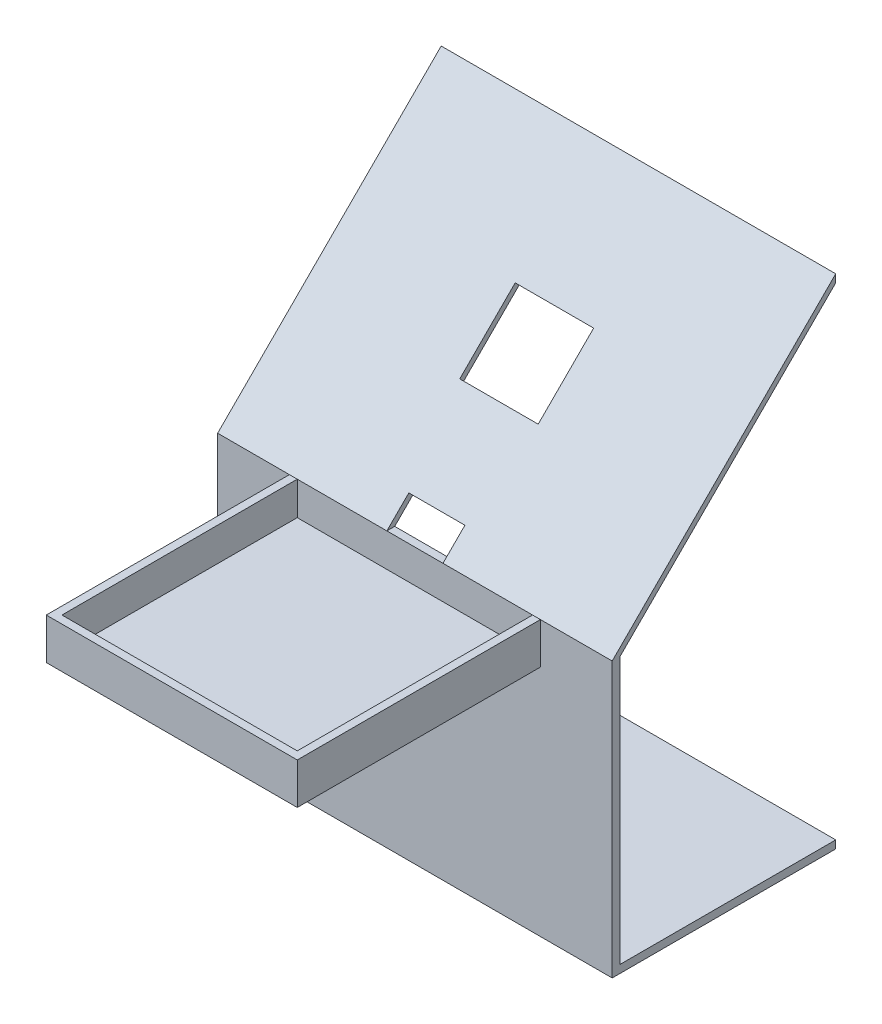
ISO-10303-21;
HEADER;
FILE_DESCRIPTION(('STEP AP214'),'2;1');
FILE_NAME('part.step','',(''),(''),'','','');
FILE_SCHEMA(('AUTOMOTIVE_DESIGN { 1 0 10303 214 1 1 1 1 }'));
ENDSEC;
DATA;
#1=APPLICATION_CONTEXT('core data for automotive mechanical design processes');
#2=APPLICATION_PROTOCOL_DEFINITION('international standard','automotive_design',2000,#1);
#3=PRODUCT_CONTEXT('',#1,'mechanical');
#4=PRODUCT('Part','Part','',(#3));
#5=PRODUCT_RELATED_PRODUCT_CATEGORY('part','',(#4));
#6=PRODUCT_DEFINITION_FORMATION('','',#4);
#7=PRODUCT_DEFINITION_CONTEXT('part definition',#1,'design');
#8=PRODUCT_DEFINITION('design','',#6,#7);
#9=PRODUCT_DEFINITION_SHAPE('','',#8);
#10=(LENGTH_UNIT() NAMED_UNIT(*) SI_UNIT(.MILLI.,.METRE.));
#11=(NAMED_UNIT(*) PLANE_ANGLE_UNIT() SI_UNIT($,.RADIAN.));
#12=(NAMED_UNIT(*) SI_UNIT($,.STERADIAN.) SOLID_ANGLE_UNIT());
#13=UNCERTAINTY_MEASURE_WITH_UNIT(LENGTH_MEASURE(1.E-05),#10,'distance_accuracy_value','');
#14=(GEOMETRIC_REPRESENTATION_CONTEXT(3) GLOBAL_UNCERTAINTY_ASSIGNED_CONTEXT((#13)) GLOBAL_UNIT_ASSIGNED_CONTEXT((#10,
#11,#12)) REPRESENTATION_CONTEXT('',''));
#15=CARTESIAN_POINT('',(0.,0.,0.));
#16=DIRECTION('',(0.,0.,1.));
#17=DIRECTION('',(1.,0.,0.));
#18=AXIS2_PLACEMENT_3D('',#15,#16,#17);
#19=CARTESIAN_POINT('',(50.3,70.,29.5));
#20=DIRECTION('',(0.,0.,1.));
#21=DIRECTION('',(1.,0.,0.));
#22=AXIS2_PLACEMENT_3D('',#19,#20,#21);
#23=PLANE('',#22);
#24=DIRECTION('',(-1.,0.,0.));
#25=VECTOR('',#24,1.);
#26=CARTESIAN_POINT('',(50.3,70.,29.5));
#27=LINE('',#26,#25);
#28=CARTESIAN_POINT('',(30.,70.,29.5));
#29=VERTEX_POINT('',#28);
#30=CARTESIAN_POINT('',(7.15,70.,29.5));
#31=VERTEX_POINT('',#30);
#32=EDGE_CURVE('E236',#29,#31,#27,.T.);
#33=ORIENTED_EDGE('',*,*,#32,.T.);
#34=CARTESIAN_POINT('',(-7.15,70.,29.5));
#35=VERTEX_POINT('',#34);
#36=EDGE_CURVE('E215',#31,#35,#27,.T.);
#37=ORIENTED_EDGE('',*,*,#36,.T.);
#38=CARTESIAN_POINT('',(-30.,70.,29.5));
#39=VERTEX_POINT('',#38);
#40=EDGE_CURVE('E221',#35,#39,#27,.T.);
#41=ORIENTED_EDGE('',*,*,#40,.T.);
#42=DIRECTION('',(0.,-1.,0.));
#43=VECTOR('',#42,1.);
#44=CARTESIAN_POINT('',(-30.,59.5,29.5));
#45=LINE('',#44,#43);
#46=CARTESIAN_POINT('',(-30.,61.5,29.5));
#47=VERTEX_POINT('',#46);
#48=EDGE_CURVE('E439',#39,#47,#45,.T.);
#49=ORIENTED_EDGE('',*,*,#48,.T.);
#50=DIRECTION('',(-1.,0.,0.));
#51=VECTOR('',#50,1.);
#52=CARTESIAN_POINT('',(-30.,61.5,29.5));
#53=LINE('',#52,#51);
#54=CARTESIAN_POINT('',(30.,61.5,29.5));
#55=VERTEX_POINT('',#54);
#56=EDGE_CURVE('E420',#55,#47,#53,.T.);
#57=ORIENTED_EDGE('',*,*,#56,.F.);
#58=DIRECTION('',(0.,1.,0.));
#59=VECTOR('',#58,1.);
#60=CARTESIAN_POINT('',(30.,70.,29.5));
#61=LINE('',#60,#59);
#62=EDGE_CURVE('E423',#55,#29,#61,.T.);
#63=ORIENTED_EDGE('',*,*,#62,.T.);
#64=EDGE_LOOP('',(#33,#37,#41,#49,#57,#63));
#65=FACE_BOUND('',#64,.T.);
#66=ADVANCED_FACE('F35',(#65),#23,.T.);
#67=DIRECTION('',(1.,0.,0.));
#68=VECTOR('',#67,1.);
#69=CARTESIAN_POINT('',(-30.,59.5,29.5));
#70=LINE('',#69,#68);
#71=CARTESIAN_POINT('',(-32.,59.5,29.5));
#72=VERTEX_POINT('',#71);
#73=CARTESIAN_POINT('',(32.,59.5,29.5));
#74=VERTEX_POINT('',#73);
#75=EDGE_CURVE('E418',#72,#74,#70,.T.);
#76=ORIENTED_EDGE('',*,*,#75,.F.);
#77=DIRECTION('',(0.,1.,0.));
#78=VECTOR('',#77,1.);
#79=CARTESIAN_POINT('',(-32.,70.,29.5));
#80=LINE('',#79,#78);
#81=CARTESIAN_POINT('',(-32.,70.,29.5));
#82=VERTEX_POINT('',#81);
#83=EDGE_CURVE('E445',#72,#82,#80,.T.);
#84=ORIENTED_EDGE('',*,*,#83,.T.);
#85=CARTESIAN_POINT('',(-50.3,70.,29.5));
#86=VERTEX_POINT('',#85);
#87=EDGE_CURVE('E230',#82,#86,#27,.T.);
#88=ORIENTED_EDGE('',*,*,#87,.T.);
#89=DIRECTION('',(0.,-1.,0.));
#90=VECTOR('',#89,1.);
#91=CARTESIAN_POINT('',(-50.3,70.,29.5));
#92=LINE('',#91,#90);
#93=CARTESIAN_POINT('',(-50.3,0.,29.5));
#94=VERTEX_POINT('',#93);
#95=EDGE_CURVE('E264',#86,#94,#92,.T.);
#96=ORIENTED_EDGE('',*,*,#95,.T.);
#97=DIRECTION('',(-1.,0.,0.));
#98=VECTOR('',#97,1.);
#99=CARTESIAN_POINT('',(50.3,0.,29.5));
#100=LINE('',#99,#98);
#101=CARTESIAN_POINT('',(50.3,0.,29.5));
#102=VERTEX_POINT('',#101);
#103=EDGE_CURVE('E267',#102,#94,#100,.T.);
#104=ORIENTED_EDGE('',*,*,#103,.F.);
#105=DIRECTION('',(0.,-1.,0.));
#106=VECTOR('',#105,1.);
#107=CARTESIAN_POINT('',(50.3,70.,29.5));
#108=LINE('',#107,#106);
#109=CARTESIAN_POINT('',(50.3,70.,29.5));
#110=VERTEX_POINT('',#109);
#111=EDGE_CURVE('E252',#110,#102,#108,.T.);
#112=ORIENTED_EDGE('',*,*,#111,.F.);
#113=CARTESIAN_POINT('',(32.,70.,29.5));
#114=VERTEX_POINT('',#113);
#115=EDGE_CURVE('E232',#110,#114,#27,.T.);
#116=ORIENTED_EDGE('',*,*,#115,.T.);
#117=DIRECTION('',(0.,-1.,0.));
#118=VECTOR('',#117,1.);
#119=CARTESIAN_POINT('',(32.,59.5,29.5));
#120=LINE('',#119,#118);
#121=EDGE_CURVE('E436',#114,#74,#120,.T.);
#122=ORIENTED_EDGE('',*,*,#121,.T.);
#123=EDGE_LOOP('',(#76,#84,#88,#96,#104,#112,#116,#122));
#124=FACE_BOUND('',#123,.T.);
#125=CARTESIAN_POINT('',(0.,51.,29.5));
#126=DIRECTION('',(0.,0.,1.));
#127=DIRECTION('',(1.,0.,0.));
#128=AXIS2_PLACEMENT_3D('',#125,#126,#127);
#129=CIRCLE('',#128,1.5);
#130=CARTESIAN_POINT('',(1.50000000000001,51.,29.5));
#131=VERTEX_POINT('',#130);
#132=EDGE_CURVE('E409',#131,#131,#129,.T.);
#133=ORIENTED_EDGE('',*,*,#132,.F.);
#134=EDGE_LOOP('',(#133));
#135=FACE_BOUND('',#134,.T.);
#136=ADVANCED_FACE('F351',(#124,#135),#23,.T.);
#137=CARTESIAN_POINT('',(50.3,2.,-27.5));
#138=DIRECTION('',(-1.,0.,0.));
#139=DIRECTION('',(0.,0.,1.));
#140=AXIS2_PLACEMENT_3D('',#137,#138,#139);
#141=PLANE('',#140);
#142=DIRECTION('',(0.,0.,-1.));
#143=VECTOR('',#142,1.);
#144=CARTESIAN_POINT('',(50.3,0.,-27.5));
#145=LINE('',#144,#143);
#146=CARTESIAN_POINT('',(50.3,0.,-27.5));
#147=VERTEX_POINT('',#146);
#148=EDGE_CURVE('E266',#102,#147,#145,.T.);
#149=ORIENTED_EDGE('',*,*,#148,.T.);
#150=DIRECTION('',(0.,-1.,0.));
#151=VECTOR('',#150,1.);
#152=CARTESIAN_POINT('',(50.3,2.,-27.5));
#153=LINE('',#152,#151);
#154=CARTESIAN_POINT('',(50.3,2.,-27.5));
#155=VERTEX_POINT('',#154);
#156=EDGE_CURVE('E323',#155,#147,#153,.T.);
#157=ORIENTED_EDGE('',*,*,#156,.F.);
#158=DIRECTION('',(0.,0.,-1.));
#159=VECTOR('',#158,1.);
#160=CARTESIAN_POINT('',(50.3,2.,-27.5));
#161=LINE('',#160,#159);
#162=CARTESIAN_POINT('',(50.3,2.,27.5));
#163=VERTEX_POINT('',#162);
#164=EDGE_CURVE('E314',#163,#155,#161,.T.);
#165=ORIENTED_EDGE('',*,*,#164,.F.);
#166=DIRECTION('',(0.,-1.,0.));
#167=VECTOR('',#166,1.);
#168=CARTESIAN_POINT('',(50.3,70.,27.5));
#169=LINE('',#168,#167);
#170=CARTESIAN_POINT('',(50.3,70.,27.5));
#171=VERTEX_POINT('',#170);
#172=EDGE_CURVE('E245',#171,#163,#169,.T.);
#173=ORIENTED_EDGE('',*,*,#172,.F.);
#174=DIRECTION('',(0.,0.707106781186544,-0.707106781186551));
#175=VECTOR('',#174,1.);
#176=CARTESIAN_POINT('',(50.3,70.,27.5));
#177=LINE('',#176,#175);
#178=CARTESIAN_POINT('',(50.3,124.999999999999,-27.5));
#179=VERTEX_POINT('',#178);
#180=EDGE_CURVE('E304',#171,#179,#177,.T.);
#181=ORIENTED_EDGE('',*,*,#180,.T.);
#182=DIRECTION('',(0.,1.,0.));
#183=VECTOR('',#182,1.);
#184=CARTESIAN_POINT('',(50.3,126.999999999999,-27.5));
#185=LINE('',#184,#183);
#186=CARTESIAN_POINT('',(50.3,126.999999999999,-27.5));
#187=VERTEX_POINT('',#186);
#188=EDGE_CURVE('E308',#179,#187,#185,.T.);
#189=ORIENTED_EDGE('',*,*,#188,.T.);
#190=DIRECTION('',(0.,-0.707106781186544,0.707106781186551));
#191=VECTOR('',#190,1.);
#192=CARTESIAN_POINT('',(50.3,70.,29.5));
#193=LINE('',#192,#191);
#194=EDGE_CURVE('E284',#187,#110,#193,.T.);
#195=ORIENTED_EDGE('',*,*,#194,.T.);
#196=ORIENTED_EDGE('',*,*,#111,.T.);
#197=EDGE_LOOP('',(#149,#157,#165,#173,#181,#189,#195,#196));
#198=FACE_BOUND('',#197,.T.);
#199=ADVANCED_FACE('F37',(#198),#141,.F.);
#200=CARTESIAN_POINT('',(-50.3,2.,-27.5));
#201=DIRECTION('',(0.,0.,1.));
#202=DIRECTION('',(1.,0.,0.));
#203=AXIS2_PLACEMENT_3D('',#200,#201,#202);
#204=PLANE('',#203);
#205=DIRECTION('',(-1.,0.,0.));
#206=VECTOR('',#205,1.);
#207=CARTESIAN_POINT('',(-50.3,0.,-27.5));
#208=LINE('',#207,#206);
#209=CARTESIAN_POINT('',(-50.3,0.,-27.5));
#210=VERTEX_POINT('',#209);
#211=EDGE_CURVE('E332',#147,#210,#208,.T.);
#212=ORIENTED_EDGE('',*,*,#211,.T.);
#213=DIRECTION('',(0.,-1.,0.));
#214=VECTOR('',#213,1.);
#215=CARTESIAN_POINT('',(-50.3,2.,-27.5));
#216=LINE('',#215,#214);
#217=CARTESIAN_POINT('',(-50.3,2.,-27.5));
#218=VERTEX_POINT('',#217);
#219=EDGE_CURVE('E320',#218,#210,#216,.T.);
#220=ORIENTED_EDGE('',*,*,#219,.F.);
#221=DIRECTION('',(-1.,0.,0.));
#222=VECTOR('',#221,1.);
#223=CARTESIAN_POINT('',(-50.3,2.,-27.5));
#224=LINE('',#223,#222);
#225=EDGE_CURVE('E258',#155,#218,#224,.T.);
#226=ORIENTED_EDGE('',*,*,#225,.F.);
#227=ORIENTED_EDGE('',*,*,#156,.T.);
#228=EDGE_LOOP('',(#212,#220,#226,#227));
#229=FACE_BOUND('',#228,.T.);
#230=ADVANCED_FACE('F339',(#229),#204,.F.);
#231=CARTESIAN_POINT('',(-50.3,2.,-27.5));
#232=DIRECTION('',(1.,0.,0.));
#233=DIRECTION('',(0.,0.,-1.));
#234=AXIS2_PLACEMENT_3D('',#231,#232,#233);
#235=PLANE('',#234);
#236=DIRECTION('',(0.,0.,1.));
#237=VECTOR('',#236,1.);
#238=CARTESIAN_POINT('',(-50.3,0.,-27.5));
#239=LINE('',#238,#237);
#240=EDGE_CURVE('E334',#210,#94,#239,.T.);
#241=ORIENTED_EDGE('',*,*,#240,.T.);
#242=ORIENTED_EDGE('',*,*,#95,.F.);
#243=DIRECTION('',(0.,-0.707106781186544,0.707106781186551));
#244=VECTOR('',#243,1.);
#245=CARTESIAN_POINT('',(-50.3,70.,29.5));
#246=LINE('',#245,#244);
#247=CARTESIAN_POINT('',(-50.3,126.999999999999,-27.5));
#248=VERTEX_POINT('',#247);
#249=EDGE_CURVE('E281',#248,#86,#246,.T.);
#250=ORIENTED_EDGE('',*,*,#249,.F.);
#251=DIRECTION('',(0.,1.,0.));
#252=VECTOR('',#251,1.);
#253=CARTESIAN_POINT('',(-50.3,126.999999999999,-27.5));
#254=LINE('',#253,#252);
#255=CARTESIAN_POINT('',(-50.3,124.999999999999,-27.5));
#256=VERTEX_POINT('',#255);
#257=EDGE_CURVE('E372',#256,#248,#254,.T.);
#258=ORIENTED_EDGE('',*,*,#257,.F.);
#259=DIRECTION('',(0.,0.707106781186544,-0.707106781186551));
#260=VECTOR('',#259,1.);
#261=CARTESIAN_POINT('',(-50.3,70.,27.5));
#262=LINE('',#261,#260);
#263=CARTESIAN_POINT('',(-50.3,70.,27.5));
#264=VERTEX_POINT('',#263);
#265=EDGE_CURVE('E374',#264,#256,#262,.T.);
#266=ORIENTED_EDGE('',*,*,#265,.F.);
#267=DIRECTION('',(0.,-1.,0.));
#268=VECTOR('',#267,1.);
#269=CARTESIAN_POINT('',(-50.3,70.,27.5));
#270=LINE('',#269,#268);
#271=CARTESIAN_POINT('',(-50.3,2.,27.5));
#272=VERTEX_POINT('',#271);
#273=EDGE_CURVE('E240',#264,#272,#270,.T.);
#274=ORIENTED_EDGE('',*,*,#273,.T.);
#275=DIRECTION('',(0.,0.,1.));
#276=VECTOR('',#275,1.);
#277=CARTESIAN_POINT('',(-50.3,2.,-27.5));
#278=LINE('',#277,#276);
#279=EDGE_CURVE('E319',#218,#272,#278,.T.);
#280=ORIENTED_EDGE('',*,*,#279,.F.);
#281=ORIENTED_EDGE('',*,*,#219,.T.);
#282=EDGE_LOOP('',(#241,#242,#250,#258,#266,#274,#280,#281));
#283=FACE_BOUND('',#282,.T.);
#284=ADVANCED_FACE('F340',(#283),#235,.F.);
#285=CARTESIAN_POINT('',(0.,2.,0.));
#286=DIRECTION('',(0.,1.,0.));
#287=DIRECTION('',(0.,0.,1.));
#288=AXIS2_PLACEMENT_3D('',#285,#286,#287);
#289=PLANE('',#288);
#290=ORIENTED_EDGE('',*,*,#164,.T.);
#291=ORIENTED_EDGE('',*,*,#225,.T.);
#292=ORIENTED_EDGE('',*,*,#279,.T.);
#293=DIRECTION('',(1.,0.,0.));
#294=VECTOR('',#293,1.);
#295=CARTESIAN_POINT('',(-50.3,2.,27.5));
#296=LINE('',#295,#294);
#297=EDGE_CURVE('E316',#272,#163,#296,.T.);
#298=ORIENTED_EDGE('',*,*,#297,.T.);
#299=EDGE_LOOP('',(#290,#291,#292,#298));
#300=FACE_BOUND('',#299,.T.);
#301=ADVANCED_FACE('F318',(#300),#289,.T.);
#302=CARTESIAN_POINT('',(0.,0.,0.));
#303=DIRECTION('',(0.,1.,0.));
#304=DIRECTION('',(0.,0.,1.));
#305=AXIS2_PLACEMENT_3D('',#302,#303,#304);
#306=PLANE('',#305);
#307=ORIENTED_EDGE('',*,*,#148,.F.);
#308=ORIENTED_EDGE('',*,*,#103,.T.);
#309=ORIENTED_EDGE('',*,*,#240,.F.);
#310=ORIENTED_EDGE('',*,*,#211,.F.);
#311=EDGE_LOOP('',(#307,#308,#309,#310));
#312=FACE_BOUND('',#311,.T.);
#313=ADVANCED_FACE('F347',(#312),#306,.F.);
#314=CARTESIAN_POINT('',(-50.3,70.,27.5));
#315=DIRECTION('',(0.,0.,-1.));
#316=DIRECTION('',(-1.,0.,0.));
#317=AXIS2_PLACEMENT_3D('',#314,#315,#316);
#318=PLANE('',#317);
#319=DIRECTION('',(1.,0.,0.));
#320=VECTOR('',#319,1.);
#321=CARTESIAN_POINT('',(-50.3,70.,27.5));
#322=LINE('',#321,#320);
#323=CARTESIAN_POINT('',(-7.15,70.,27.5));
#324=VERTEX_POINT('',#323);
#325=EDGE_CURVE('E274',#264,#324,#322,.T.);
#326=ORIENTED_EDGE('',*,*,#325,.T.);
#327=CARTESIAN_POINT('',(7.15,70.,27.5));
#328=VERTEX_POINT('',#327);
#329=EDGE_CURVE('E217',#324,#328,#322,.T.);
#330=ORIENTED_EDGE('',*,*,#329,.T.);
#331=EDGE_CURVE('E269',#328,#171,#322,.T.);
#332=ORIENTED_EDGE('',*,*,#331,.T.);
#333=ORIENTED_EDGE('',*,*,#172,.T.);
#334=ORIENTED_EDGE('',*,*,#297,.F.);
#335=ORIENTED_EDGE('',*,*,#273,.F.);
#336=EDGE_LOOP('',(#326,#330,#332,#333,#334,#335));
#337=FACE_BOUND('',#336,.T.);
#338=CARTESIAN_POINT('',(0.,51.,27.5));
#339=DIRECTION('',(0.,0.,-1.));
#340=DIRECTION('',(-1.,0.,0.));
#341=AXIS2_PLACEMENT_3D('',#338,#339,#340);
#342=CIRCLE('',#341,1.5);
#343=CARTESIAN_POINT('',(-1.5,51.,27.5));
#344=VERTEX_POINT('',#343);
#345=EDGE_CURVE('E400',#344,#344,#342,.F.);
#346=ORIENTED_EDGE('',*,*,#345,.T.);
#347=EDGE_LOOP('',(#346));
#348=FACE_BOUND('',#347,.T.);
#349=ADVANCED_FACE('F288',(#337,#348),#318,.T.);
#350=CARTESIAN_POINT('',(-50.3,70.,29.5));
#351=DIRECTION('',(0.,0.707106781186551,0.707106781186544));
#352=DIRECTION('',(0.,-0.707106781186544,0.707106781186551));
#353=AXIS2_PLACEMENT_3D('',#350,#351,#352);
#354=PLANE('',#353);
#355=DIRECTION('',(-1.,0.,0.));
#356=VECTOR('',#355,1.);
#357=CARTESIAN_POINT('',(-50.3,75.6,23.8999999999999));
#358=LINE('',#357,#356);
#359=CARTESIAN_POINT('',(7.15,75.6,23.8999999999999));
#360=VERTEX_POINT('',#359);
#361=CARTESIAN_POINT('',(-7.15,75.6,23.8999999999999));
#362=VERTEX_POINT('',#361);
#363=EDGE_CURVE('E467',#360,#362,#358,.T.);
#364=ORIENTED_EDGE('',*,*,#363,.F.);
#365=DIRECTION('',(0.,0.707106781186544,-0.707106781186551));
#366=VECTOR('',#365,1.);
#367=CARTESIAN_POINT('',(7.15,70.,29.5));
#368=LINE('',#367,#366);
#369=EDGE_CURVE('E208',#31,#360,#368,.T.);
#370=ORIENTED_EDGE('',*,*,#369,.F.);
#371=ORIENTED_EDGE('',*,*,#32,.F.);
#372=DIRECTION('',(1.,0.,0.));
#373=VECTOR('',#372,1.);
#374=CARTESIAN_POINT('',(32.,70.,29.5));
#375=LINE('',#374,#373);
#376=EDGE_CURVE('E433',#29,#114,#375,.T.);
#377=ORIENTED_EDGE('',*,*,#376,.T.);
#378=ORIENTED_EDGE('',*,*,#115,.F.);
#379=ORIENTED_EDGE('',*,*,#194,.F.);
#380=DIRECTION('',(1.,0.,0.));
#381=VECTOR('',#380,1.);
#382=CARTESIAN_POINT('',(-50.3,126.999999999999,-27.5));
#383=LINE('',#382,#381);
#384=EDGE_CURVE('E270',#248,#187,#383,.T.);
#385=ORIENTED_EDGE('',*,*,#384,.F.);
#386=ORIENTED_EDGE('',*,*,#249,.T.);
#387=ORIENTED_EDGE('',*,*,#87,.F.);
#388=DIRECTION('',(1.,0.,0.));
#389=VECTOR('',#388,1.);
#390=CARTESIAN_POINT('',(-30.,70.,29.5));
#391=LINE('',#390,#389);
#392=EDGE_CURVE('E226',#82,#39,#391,.T.);
#393=ORIENTED_EDGE('',*,*,#392,.T.);
#394=ORIENTED_EDGE('',*,*,#40,.F.);
#395=DIRECTION('',(0.,-0.707106781186544,0.707106781186551));
#396=VECTOR('',#395,1.);
#397=CARTESIAN_POINT('',(-7.15,70.,29.5));
#398=LINE('',#397,#396);
#399=EDGE_CURVE('E198',#362,#35,#398,.T.);
#400=ORIENTED_EDGE('',*,*,#399,.F.);
#401=EDGE_LOOP('',(#364,#370,#371,#377,#378,#379,#385,#386,#387,#393,#394,#400));
#402=FACE_BOUND('',#401,.T.);
#403=DIRECTION('',(-1.,0.,0.));
#404=VECTOR('',#403,1.);
#405=CARTESIAN_POINT('',(-10.,105.571067811865,-6.07106781186551));
#406=LINE('',#405,#404);
#407=CARTESIAN_POINT('',(9.99999999999998,105.571067811865,-6.07106781186551));
#408=VERTEX_POINT('',#407);
#409=CARTESIAN_POINT('',(-10.,105.571067811865,-6.07106781186551));
#410=VERTEX_POINT('',#409);
#411=EDGE_CURVE('E399',#408,#410,#406,.T.);
#412=ORIENTED_EDGE('',*,*,#411,.F.);
#413=DIRECTION('',(0.,0.707106781186544,-0.707106781186551));
#414=VECTOR('',#413,1.);
#415=CARTESIAN_POINT('',(9.99999999999998,105.571067811865,-6.07106781186551));
#416=LINE('',#415,#414);
#417=CARTESIAN_POINT('',(9.99999999999998,91.4289321881343,8.07106781186552));
#418=VERTEX_POINT('',#417);
#419=EDGE_CURVE('E397',#418,#408,#416,.T.);
#420=ORIENTED_EDGE('',*,*,#419,.F.);
#421=DIRECTION('',(1.,0.,0.));
#422=VECTOR('',#421,1.);
#423=CARTESIAN_POINT('',(-10.,91.4289321881343,8.07106781186552));
#424=LINE('',#423,#422);
#425=CARTESIAN_POINT('',(-10.,91.4289321881343,8.07106781186552));
#426=VERTEX_POINT('',#425);
#427=EDGE_CURVE('E50',#426,#418,#424,.T.);
#428=ORIENTED_EDGE('',*,*,#427,.F.);
#429=DIRECTION('',(0.,-0.707106781186544,0.707106781186551));
#430=VECTOR('',#429,1.);
#431=CARTESIAN_POINT('',(-10.,105.571067811865,-6.07106781186551));
#432=LINE('',#431,#430);
#433=EDGE_CURVE('E403',#410,#426,#432,.T.);
#434=ORIENTED_EDGE('',*,*,#433,.F.);
#435=EDGE_LOOP('',(#412,#420,#428,#434));
#436=FACE_BOUND('',#435,.T.);
#437=ADVANCED_FACE('F222',(#402,#436),#354,.T.);
#438=CARTESIAN_POINT('',(-50.3,126.999999999999,-27.5));
#439=DIRECTION('',(0.,0.,-1.));
#440=DIRECTION('',(0.,1.,0.));
#441=AXIS2_PLACEMENT_3D('',#438,#439,#440);
#442=PLANE('',#441);
#443=ORIENTED_EDGE('',*,*,#188,.F.);
#444=DIRECTION('',(1.,0.,0.));
#445=VECTOR('',#444,1.);
#446=CARTESIAN_POINT('',(-50.3,124.999999999999,-27.5));
#447=LINE('',#446,#445);
#448=EDGE_CURVE('E275',#256,#179,#447,.T.);
#449=ORIENTED_EDGE('',*,*,#448,.F.);
#450=ORIENTED_EDGE('',*,*,#257,.T.);
#451=ORIENTED_EDGE('',*,*,#384,.T.);
#452=EDGE_LOOP('',(#443,#449,#450,#451));
#453=FACE_BOUND('',#452,.T.);
#454=ADVANCED_FACE('F562',(#453),#442,.T.);
#455=CARTESIAN_POINT('',(-50.3,70.,27.5));
#456=DIRECTION('',(0.,-0.707106781186551,-0.707106781186544));
#457=DIRECTION('',(0.,0.707106781186544,-0.707106781186551));
#458=AXIS2_PLACEMENT_3D('',#455,#456,#457);
#459=PLANE('',#458);
#460=DIRECTION('',(0.,-0.707106781186544,0.707106781186551));
#461=VECTOR('',#460,1.);
#462=CARTESIAN_POINT('',(7.15,70.,27.5));
#463=LINE('',#462,#461);
#464=CARTESIAN_POINT('',(7.15,75.6,21.8999999999999));
#465=VERTEX_POINT('',#464);
#466=EDGE_CURVE('E11',#465,#328,#463,.T.);
#467=ORIENTED_EDGE('',*,*,#466,.F.);
#468=DIRECTION('',(1.,0.,0.));
#469=VECTOR('',#468,1.);
#470=CARTESIAN_POINT('',(-50.3,75.6,21.9));
#471=LINE('',#470,#469);
#472=CARTESIAN_POINT('',(-7.15,75.6,21.9));
#473=VERTEX_POINT('',#472);
#474=EDGE_CURVE('E464',#473,#465,#471,.T.);
#475=ORIENTED_EDGE('',*,*,#474,.F.);
#476=DIRECTION('',(0.,0.707106781186544,-0.707106781186551));
#477=VECTOR('',#476,1.);
#478=CARTESIAN_POINT('',(-7.15,70.,27.5));
#479=LINE('',#478,#477);
#480=EDGE_CURVE('E43',#324,#473,#479,.T.);
#481=ORIENTED_EDGE('',*,*,#480,.F.);
#482=ORIENTED_EDGE('',*,*,#325,.F.);
#483=ORIENTED_EDGE('',*,*,#265,.T.);
#484=ORIENTED_EDGE('',*,*,#448,.T.);
#485=ORIENTED_EDGE('',*,*,#180,.F.);
#486=ORIENTED_EDGE('',*,*,#331,.F.);
#487=EDGE_LOOP('',(#467,#475,#481,#482,#483,#484,#485,#486));
#488=FACE_BOUND('',#487,.T.);
#489=DIRECTION('',(-1.,0.,0.));
#490=VECTOR('',#489,1.);
#491=CARTESIAN_POINT('',(-10.,104.571067811865,-7.0710678118655));
#492=LINE('',#491,#490);
#493=CARTESIAN_POINT('',(9.99999999999998,104.571067811865,-7.07106781186549));
#494=VERTEX_POINT('',#493);
#495=CARTESIAN_POINT('',(-10.,104.571067811865,-7.07106781186549));
#496=VERTEX_POINT('',#495);
#497=EDGE_CURVE('E383',#494,#496,#492,.T.);
#498=ORIENTED_EDGE('',*,*,#497,.T.);
#499=DIRECTION('',(0.,-0.707106781186544,0.707106781186551));
#500=VECTOR('',#499,1.);
#501=CARTESIAN_POINT('',(-10.,104.571067811865,-7.07106781186549));
#502=LINE('',#501,#500);
#503=CARTESIAN_POINT('',(-10.,90.4289321881343,7.07106781186554));
#504=VERTEX_POINT('',#503);
#505=EDGE_CURVE('E382',#496,#504,#502,.T.);
#506=ORIENTED_EDGE('',*,*,#505,.T.);
#507=DIRECTION('',(1.,0.,0.));
#508=VECTOR('',#507,1.);
#509=CARTESIAN_POINT('',(-10.,90.4289321881343,7.07106781186554));
#510=LINE('',#509,#508);
#511=CARTESIAN_POINT('',(9.99999999999998,90.4289321881343,7.07106781186554));
#512=VERTEX_POINT('',#511);
#513=EDGE_CURVE('E386',#504,#512,#510,.T.);
#514=ORIENTED_EDGE('',*,*,#513,.T.);
#515=DIRECTION('',(0.,0.707106781186544,-0.707106781186551));
#516=VECTOR('',#515,1.);
#517=CARTESIAN_POINT('',(9.99999999999998,104.571067811865,-7.0710678118655));
#518=LINE('',#517,#516);
#519=EDGE_CURVE('E379',#512,#494,#518,.T.);
#520=ORIENTED_EDGE('',*,*,#519,.T.);
#521=EDGE_LOOP('',(#498,#506,#514,#520));
#522=FACE_BOUND('',#521,.T.);
#523=ADVANCED_FACE('F301',(#488,#522),#459,.T.);
#524=CARTESIAN_POINT('',(-10.,84.571067811865,-27.0710678118654));
#525=DIRECTION('',(0.,0.707106781186544,-0.707106781186551));
#526=DIRECTION('',(0.,0.707106781186551,0.707106781186544));
#527=AXIS2_PLACEMENT_3D('',#524,#525,#526);
#528=PLANE('',#527);
#529=DIRECTION('',(0.,0.707106781186551,0.707106781186544));
#530=VECTOR('',#529,1.);
#531=CARTESIAN_POINT('',(9.99999999999998,84.571067811865,-27.0710678118654));
#532=LINE('',#531,#530);
#533=EDGE_CURVE('E58',#494,#408,#532,.T.);
#534=ORIENTED_EDGE('',*,*,#533,.T.);
#535=ORIENTED_EDGE('',*,*,#411,.T.);
#536=DIRECTION('',(0.,0.707106781186551,0.707106781186544));
#537=VECTOR('',#536,1.);
#538=CARTESIAN_POINT('',(-10.,84.571067811865,-27.0710678118654));
#539=LINE('',#538,#537);
#540=EDGE_CURVE('E380',#496,#410,#539,.T.);
#541=ORIENTED_EDGE('',*,*,#540,.F.);
#542=ORIENTED_EDGE('',*,*,#497,.F.);
#543=EDGE_LOOP('',(#534,#535,#541,#542));
#544=FACE_BOUND('',#543,.T.);
#545=ADVANCED_FACE('F556',(#544),#528,.F.);
#546=CARTESIAN_POINT('',(-10.,84.571067811865,-27.0710678118654));
#547=DIRECTION('',(-1.,0.,0.));
#548=DIRECTION('',(0.,0.,1.));
#549=AXIS2_PLACEMENT_3D('',#546,#547,#548);
#550=PLANE('',#549);
#551=ORIENTED_EDGE('',*,*,#540,.T.);
#552=ORIENTED_EDGE('',*,*,#433,.T.);
#553=DIRECTION('',(0.,0.707106781186551,0.707106781186544));
#554=VECTOR('',#553,1.);
#555=CARTESIAN_POINT('',(-10.,70.4289321881341,-12.9289321881344));
#556=LINE('',#555,#554);
#557=EDGE_CURVE('E384',#504,#426,#556,.T.);
#558=ORIENTED_EDGE('',*,*,#557,.F.);
#559=ORIENTED_EDGE('',*,*,#505,.F.);
#560=EDGE_LOOP('',(#551,#552,#558,#559));
#561=FACE_BOUND('',#560,.T.);
#562=ADVANCED_FACE('F553',(#561),#550,.F.);
#563=CARTESIAN_POINT('',(-10.,70.4289321881341,-12.9289321881344));
#564=DIRECTION('',(0.,-0.707106781186544,0.707106781186551));
#565=DIRECTION('',(0.,-0.707106781186551,-0.707106781186544));
#566=AXIS2_PLACEMENT_3D('',#563,#564,#565);
#567=PLANE('',#566);
#568=ORIENTED_EDGE('',*,*,#557,.T.);
#569=ORIENTED_EDGE('',*,*,#427,.T.);
#570=DIRECTION('',(0.,0.707106781186551,0.707106781186544));
#571=VECTOR('',#570,1.);
#572=CARTESIAN_POINT('',(9.99999999999998,70.4289321881341,-12.9289321881344));
#573=LINE('',#572,#571);
#574=EDGE_CURVE('E387',#512,#418,#573,.T.);
#575=ORIENTED_EDGE('',*,*,#574,.F.);
#576=ORIENTED_EDGE('',*,*,#513,.F.);
#577=EDGE_LOOP('',(#568,#569,#575,#576));
#578=FACE_BOUND('',#577,.T.);
#579=ADVANCED_FACE('F550',(#578),#567,.F.);
#580=CARTESIAN_POINT('',(9.99999999999998,84.571067811865,-27.0710678118654));
#581=DIRECTION('',(1.,0.,0.));
#582=DIRECTION('',(0.,0.,-1.));
#583=AXIS2_PLACEMENT_3D('',#580,#581,#582);
#584=PLANE('',#583);
#585=ORIENTED_EDGE('',*,*,#574,.T.);
#586=ORIENTED_EDGE('',*,*,#419,.T.);
#587=ORIENTED_EDGE('',*,*,#533,.F.);
#588=ORIENTED_EDGE('',*,*,#519,.F.);
#589=EDGE_LOOP('',(#585,#586,#587,#588));
#590=FACE_BOUND('',#589,.T.);
#591=ADVANCED_FACE('F546',(#590),#584,.F.);
#592=CARTESIAN_POINT('',(0.,51.,23.2573593128807));
#593=DIRECTION('',(0.,0.,1.));
#594=DIRECTION('',(1.,0.,0.));
#595=AXIS2_PLACEMENT_3D('',#592,#593,#594);
#596=CYLINDRICAL_SURFACE('',#595,1.5);
#597=ORIENTED_EDGE('',*,*,#132,.T.);
#598=EDGE_LOOP('',(#597));
#599=FACE_BOUND('',#598,.T.);
#600=ORIENTED_EDGE('',*,*,#345,.F.);
#601=EDGE_LOOP('',(#600));
#602=FACE_BOUND('',#601,.T.);
#603=ADVANCED_FACE('F543',(#599,#602),#596,.F.);
#604=CARTESIAN_POINT('',(-30.,61.5,89.5));
#605=DIRECTION('',(0.,-1.,0.));
#606=DIRECTION('',(0.,0.,-1.));
#607=AXIS2_PLACEMENT_3D('',#604,#605,#606);
#608=PLANE('',#607);
#609=ORIENTED_EDGE('',*,*,#56,.T.);
#610=DIRECTION('',(0.,0.,-1.));
#611=VECTOR('',#610,1.);
#612=CARTESIAN_POINT('',(-30.,61.5,89.5));
#613=LINE('',#612,#611);
#614=CARTESIAN_POINT('',(-30.,61.5,89.5));
#615=VERTEX_POINT('',#614);
#616=EDGE_CURVE('E415',#615,#47,#613,.T.);
#617=ORIENTED_EDGE('',*,*,#616,.F.);
#618=DIRECTION('',(-1.,0.,0.));
#619=VECTOR('',#618,1.);
#620=CARTESIAN_POINT('',(-30.,61.5,89.5));
#621=LINE('',#620,#619);
#622=CARTESIAN_POINT('',(30.,61.5,89.5));
#623=VERTEX_POINT('',#622);
#624=EDGE_CURVE('E417',#623,#615,#621,.T.);
#625=ORIENTED_EDGE('',*,*,#624,.F.);
#626=DIRECTION('',(0.,0.,-1.));
#627=VECTOR('',#626,1.);
#628=CARTESIAN_POINT('',(30.,61.5,89.5));
#629=LINE('',#628,#627);
#630=EDGE_CURVE('E412',#623,#55,#629,.T.);
#631=ORIENTED_EDGE('',*,*,#630,.T.);
#632=EDGE_LOOP('',(#609,#617,#625,#631));
#633=FACE_BOUND('',#632,.T.);
#634=ADVANCED_FACE('F490',(#633),#608,.F.);
#635=CARTESIAN_POINT('',(-30.,59.5,89.5));
#636=DIRECTION('',(0.,1.,0.));
#637=DIRECTION('',(0.,0.,1.));
#638=AXIS2_PLACEMENT_3D('',#635,#636,#637);
#639=PLANE('',#638);
#640=ORIENTED_EDGE('',*,*,#75,.T.);
#641=DIRECTION('',(0.,0.,1.));
#642=VECTOR('',#641,1.);
#643=CARTESIAN_POINT('',(32.,59.5,18.811220836784));
#644=LINE('',#643,#642);
#645=CARTESIAN_POINT('',(32.,59.5,91.5));
#646=VERTEX_POINT('',#645);
#647=EDGE_CURVE('E426',#74,#646,#644,.T.);
#648=ORIENTED_EDGE('',*,*,#647,.T.);
#649=DIRECTION('',(-1.,0.,0.));
#650=VECTOR('',#649,1.);
#651=CARTESIAN_POINT('',(-32.,59.5,91.5));
#652=LINE('',#651,#650);
#653=CARTESIAN_POINT('',(-32.,59.5,91.5));
#654=VERTEX_POINT('',#653);
#655=EDGE_CURVE('E472',#646,#654,#652,.T.);
#656=ORIENTED_EDGE('',*,*,#655,.T.);
#657=DIRECTION('',(0.,0.,1.));
#658=VECTOR('',#657,1.);
#659=CARTESIAN_POINT('',(-32.,59.5,18.811220836784));
#660=LINE('',#659,#658);
#661=EDGE_CURVE('E442',#72,#654,#660,.T.);
#662=ORIENTED_EDGE('',*,*,#661,.F.);
#663=EDGE_LOOP('',(#640,#648,#656,#662));
#664=FACE_BOUND('',#663,.T.);
#665=ADVANCED_FACE('F515',(#664),#639,.F.);
#666=CARTESIAN_POINT('',(30.,70.,18.811220836784));
#667=DIRECTION('',(-1.,0.,0.));
#668=DIRECTION('',(0.,0.,1.));
#669=AXIS2_PLACEMENT_3D('',#666,#667,#668);
#670=PLANE('',#669);
#671=ORIENTED_EDGE('',*,*,#630,.F.);
#672=DIRECTION('',(0.,-1.,0.));
#673=VECTOR('',#672,1.);
#674=CARTESIAN_POINT('',(30.,70.,89.5));
#675=LINE('',#674,#673);
#676=CARTESIAN_POINT('',(30.,70.,89.5));
#677=VERTEX_POINT('',#676);
#678=EDGE_CURVE('E429',#677,#623,#675,.T.);
#679=ORIENTED_EDGE('',*,*,#678,.F.);
#680=DIRECTION('',(0.,0.,1.));
#681=VECTOR('',#680,1.);
#682=CARTESIAN_POINT('',(30.,70.,18.811220836784));
#683=LINE('',#682,#681);
#684=EDGE_CURVE('E431',#29,#677,#683,.T.);
#685=ORIENTED_EDGE('',*,*,#684,.F.);
#686=ORIENTED_EDGE('',*,*,#62,.F.);
#687=EDGE_LOOP('',(#671,#679,#685,#686));
#688=FACE_BOUND('',#687,.T.);
#689=ADVANCED_FACE('F494',(#688),#670,.T.);
#690=CARTESIAN_POINT('',(32.,70.,18.811220836784));
#691=DIRECTION('',(0.,1.,0.));
#692=DIRECTION('',(0.,0.,1.));
#693=AXIS2_PLACEMENT_3D('',#690,#691,#692);
#694=PLANE('',#693);
#695=ORIENTED_EDGE('',*,*,#376,.F.);
#696=ORIENTED_EDGE('',*,*,#684,.T.);
#697=DIRECTION('',(1.,0.,0.));
#698=VECTOR('',#697,1.);
#699=CARTESIAN_POINT('',(32.,70.,89.5));
#700=LINE('',#699,#698);
#701=CARTESIAN_POINT('',(-30.,70.,89.5));
#702=VERTEX_POINT('',#701);
#703=EDGE_CURVE('E454',#702,#677,#700,.T.);
#704=ORIENTED_EDGE('',*,*,#703,.F.);
#705=DIRECTION('',(0.,0.,1.));
#706=VECTOR('',#705,1.);
#707=CARTESIAN_POINT('',(-30.,70.,18.811220836784));
#708=LINE('',#707,#706);
#709=EDGE_CURVE('E443',#39,#702,#708,.T.);
#710=ORIENTED_EDGE('',*,*,#709,.F.);
#711=ORIENTED_EDGE('',*,*,#392,.F.);
#712=DIRECTION('',(0.,0.,1.));
#713=VECTOR('',#712,1.);
#714=CARTESIAN_POINT('',(-32.,70.,18.811220836784));
#715=LINE('',#714,#713);
#716=CARTESIAN_POINT('',(-32.,70.,91.5));
#717=VERTEX_POINT('',#716);
#718=EDGE_CURVE('E440',#82,#717,#715,.T.);
#719=ORIENTED_EDGE('',*,*,#718,.T.);
#720=DIRECTION('',(-1.,0.,0.));
#721=VECTOR('',#720,1.);
#722=CARTESIAN_POINT('',(-32.,70.,91.5));
#723=LINE('',#722,#721);
#724=CARTESIAN_POINT('',(32.,70.,91.5));
#725=VERTEX_POINT('',#724);
#726=EDGE_CURVE('E478',#725,#717,#723,.T.);
#727=ORIENTED_EDGE('',*,*,#726,.F.);
#728=DIRECTION('',(0.,0.,1.));
#729=VECTOR('',#728,1.);
#730=CARTESIAN_POINT('',(32.,70.,18.811220836784));
#731=LINE('',#730,#729);
#732=EDGE_CURVE('E428',#114,#725,#731,.T.);
#733=ORIENTED_EDGE('',*,*,#732,.F.);
#734=EDGE_LOOP('',(#695,#696,#704,#710,#711,#719,#727,#733));
#735=FACE_BOUND('',#734,.T.);
#736=ADVANCED_FACE('F499',(#735),#694,.T.);
#737=CARTESIAN_POINT('',(32.,59.5,18.811220836784));
#738=DIRECTION('',(1.,0.,0.));
#739=DIRECTION('',(0.,0.,-1.));
#740=AXIS2_PLACEMENT_3D('',#737,#738,#739);
#741=PLANE('',#740);
#742=ORIENTED_EDGE('',*,*,#121,.F.);
#743=ORIENTED_EDGE('',*,*,#732,.T.);
#744=DIRECTION('',(0.,-1.,0.));
#745=VECTOR('',#744,1.);
#746=CARTESIAN_POINT('',(32.,134.031242374328,91.5));
#747=LINE('',#746,#745);
#748=EDGE_CURVE('E475',#725,#646,#747,.T.);
#749=ORIENTED_EDGE('',*,*,#748,.T.);
#750=ORIENTED_EDGE('',*,*,#647,.F.);
#751=EDGE_LOOP('',(#742,#743,#749,#750));
#752=FACE_BOUND('',#751,.T.);
#753=ADVANCED_FACE('F506',(#752),#741,.T.);
#754=CARTESIAN_POINT('',(-30.,59.5,18.811220836784));
#755=DIRECTION('',(1.,0.,0.));
#756=DIRECTION('',(0.,1.,0.));
#757=AXIS2_PLACEMENT_3D('',#754,#755,#756);
#758=PLANE('',#757);
#759=ORIENTED_EDGE('',*,*,#616,.T.);
#760=ORIENTED_EDGE('',*,*,#48,.F.);
#761=ORIENTED_EDGE('',*,*,#709,.T.);
#762=DIRECTION('',(0.,1.,0.));
#763=VECTOR('',#762,1.);
#764=CARTESIAN_POINT('',(-30.,59.5,89.5));
#765=LINE('',#764,#763);
#766=EDGE_CURVE('E450',#615,#702,#765,.T.);
#767=ORIENTED_EDGE('',*,*,#766,.F.);
#768=EDGE_LOOP('',(#759,#760,#761,#767));
#769=FACE_BOUND('',#768,.T.);
#770=ADVANCED_FACE('F527',(#769),#758,.T.);
#771=CARTESIAN_POINT('',(-32.,70.,18.811220836784));
#772=DIRECTION('',(-1.,0.,0.));
#773=DIRECTION('',(0.,0.,1.));
#774=AXIS2_PLACEMENT_3D('',#771,#772,#773);
#775=PLANE('',#774);
#776=ORIENTED_EDGE('',*,*,#83,.F.);
#777=ORIENTED_EDGE('',*,*,#661,.T.);
#778=DIRECTION('',(0.,-1.,0.));
#779=VECTOR('',#778,1.);
#780=CARTESIAN_POINT('',(-32.,134.031242374328,91.5));
#781=LINE('',#780,#779);
#782=EDGE_CURVE('E483',#717,#654,#781,.T.);
#783=ORIENTED_EDGE('',*,*,#782,.F.);
#784=ORIENTED_EDGE('',*,*,#718,.F.);
#785=EDGE_LOOP('',(#776,#777,#783,#784));
#786=FACE_BOUND('',#785,.T.);
#787=ADVANCED_FACE('F512',(#786),#775,.T.);
#788=CARTESIAN_POINT('',(-32.,134.031242374328,91.5));
#789=DIRECTION('',(0.,0.,1.));
#790=DIRECTION('',(1.,0.,0.));
#791=AXIS2_PLACEMENT_3D('',#788,#789,#790);
#792=PLANE('',#791);
#793=ORIENTED_EDGE('',*,*,#748,.F.);
#794=ORIENTED_EDGE('',*,*,#726,.T.);
#795=ORIENTED_EDGE('',*,*,#782,.T.);
#796=ORIENTED_EDGE('',*,*,#655,.F.);
#797=EDGE_LOOP('',(#793,#794,#795,#796));
#798=FACE_BOUND('',#797,.T.);
#799=ADVANCED_FACE('F517',(#798),#792,.T.);
#800=CARTESIAN_POINT('',(32.,134.031242374328,89.5));
#801=DIRECTION('',(0.,0.,-1.));
#802=DIRECTION('',(-1.,0.,0.));
#803=AXIS2_PLACEMENT_3D('',#800,#801,#802);
#804=PLANE('',#803);
#805=ORIENTED_EDGE('',*,*,#703,.T.);
#806=ORIENTED_EDGE('',*,*,#678,.T.);
#807=ORIENTED_EDGE('',*,*,#624,.T.);
#808=ORIENTED_EDGE('',*,*,#766,.T.);
#809=EDGE_LOOP('',(#805,#806,#807,#808));
#810=FACE_BOUND('',#809,.T.);
#811=ADVANCED_FACE('F519',(#810),#804,.T.);
#812=CARTESIAN_POINT('',(-5.00000000000002,70.,29.5));
#813=DIRECTION('',(0.,1.,0.));
#814=DIRECTION('',(0.,0.,1.));
#815=AXIS2_PLACEMENT_3D('',#812,#813,#814);
#816=PLANE('',#815);
#817=ORIENTED_EDGE('',*,*,#329,.F.);
#818=DIRECTION('',(0.,0.,1.));
#819=VECTOR('',#818,1.);
#820=CARTESIAN_POINT('',(-7.15,70.,19.5));
#821=LINE('',#820,#819);
#822=EDGE_CURVE('E202',#324,#35,#821,.T.);
#823=ORIENTED_EDGE('',*,*,#822,.T.);
#824=ORIENTED_EDGE('',*,*,#36,.F.);
#825=DIRECTION('',(0.,0.,1.));
#826=VECTOR('',#825,1.);
#827=CARTESIAN_POINT('',(7.15,70.,19.5));
#828=LINE('',#827,#826);
#829=EDGE_CURVE('E218',#328,#31,#828,.T.);
#830=ORIENTED_EDGE('',*,*,#829,.F.);
#831=EDGE_LOOP('',(#817,#823,#824,#830));
#832=FACE_BOUND('',#831,.T.);
#833=ADVANCED_FACE('F212',(#832),#816,.T.);
#834=CARTESIAN_POINT('',(-4.99999999999998,75.6,18.5));
#835=DIRECTION('',(0.,1.,0.));
#836=DIRECTION('',(0.,0.,1.));
#837=AXIS2_PLACEMENT_3D('',#834,#835,#836);
#838=PLANE('',#837);
#839=ORIENTED_EDGE('',*,*,#363,.T.);
#840=DIRECTION('',(0.,0.,1.));
#841=VECTOR('',#840,1.);
#842=CARTESIAN_POINT('',(-7.15,75.6,19.5));
#843=LINE('',#842,#841);
#844=EDGE_CURVE('E205',#473,#362,#843,.T.);
#845=ORIENTED_EDGE('',*,*,#844,.F.);
#846=ORIENTED_EDGE('',*,*,#474,.T.);
#847=DIRECTION('',(0.,0.,1.));
#848=VECTOR('',#847,1.);
#849=CARTESIAN_POINT('',(7.15,75.6,19.5));
#850=LINE('',#849,#848);
#851=EDGE_CURVE('E209',#465,#360,#850,.T.);
#852=ORIENTED_EDGE('',*,*,#851,.T.);
#853=EDGE_LOOP('',(#839,#845,#846,#852));
#854=FACE_BOUND('',#853,.T.);
#855=ADVANCED_FACE('F466',(#854),#838,.F.);
#856=CARTESIAN_POINT('',(-7.15,70.,19.5));
#857=DIRECTION('',(-1.,0.,0.));
#858=DIRECTION('',(0.,0.,1.));
#859=AXIS2_PLACEMENT_3D('',#856,#857,#858);
#860=PLANE('',#859);
#861=ORIENTED_EDGE('',*,*,#399,.T.);
#862=ORIENTED_EDGE('',*,*,#822,.F.);
#863=ORIENTED_EDGE('',*,*,#480,.T.);
#864=ORIENTED_EDGE('',*,*,#844,.T.);
#865=EDGE_LOOP('',(#861,#862,#863,#864));
#866=FACE_BOUND('',#865,.T.);
#867=ADVANCED_FACE('F200',(#866),#860,.F.);
#868=CARTESIAN_POINT('',(7.15,75.6,19.5));
#869=DIRECTION('',(1.,0.,0.));
#870=DIRECTION('',(0.,1.,0.));
#871=AXIS2_PLACEMENT_3D('',#868,#869,#870);
#872=PLANE('',#871);
#873=ORIENTED_EDGE('',*,*,#369,.T.);
#874=ORIENTED_EDGE('',*,*,#851,.F.);
#875=ORIENTED_EDGE('',*,*,#466,.T.);
#876=ORIENTED_EDGE('',*,*,#829,.T.);
#877=EDGE_LOOP('',(#873,#874,#875,#876));
#878=FACE_BOUND('',#877,.T.);
#879=ADVANCED_FACE('F296',(#878),#872,.F.);
#880=CLOSED_SHELL('',(#66,#136,#199,#230,#284,#301,#313,#349,#437,#454,#523,#545,#562,#579,#591,
#603,#634,#665,#689,#736,#753,#770,#787,#799,#811,#833,#855,#867,#879));
#881=MANIFOLD_SOLID_BREP('B2',#880);
#882=ADVANCED_BREP_SHAPE_REPRESENTATION('',(#18,#881),#14);
#883=SHAPE_DEFINITION_REPRESENTATION(#9,#882);
ENDSEC;
END-ISO-10303-21;
